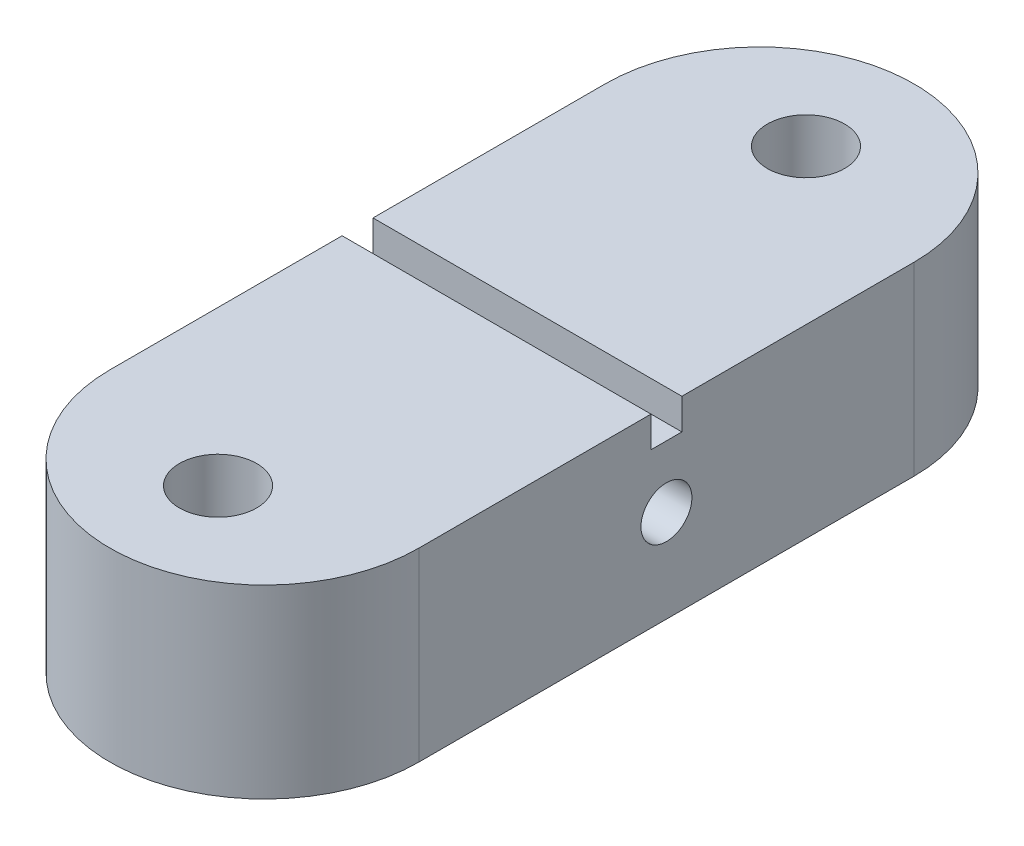
ISO-10303-21;
HEADER;
FILE_DESCRIPTION(('STEP AP214'),'2;1');
FILE_NAME('part.step','',(''),(''),'','','');
FILE_SCHEMA(('AUTOMOTIVE_DESIGN { 1 0 10303 214 1 1 1 1 }'));
ENDSEC;
DATA;
#1=APPLICATION_CONTEXT('core data for automotive mechanical design processes');
#2=APPLICATION_PROTOCOL_DEFINITION('international standard','automotive_design',2000,#1);
#3=PRODUCT_CONTEXT('',#1,'mechanical');
#4=PRODUCT('Part','Part','',(#3));
#5=PRODUCT_RELATED_PRODUCT_CATEGORY('part','',(#4));
#6=PRODUCT_DEFINITION_FORMATION('','',#4);
#7=PRODUCT_DEFINITION_CONTEXT('part definition',#1,'design');
#8=PRODUCT_DEFINITION('design','',#6,#7);
#9=PRODUCT_DEFINITION_SHAPE('','',#8);
#10=(LENGTH_UNIT() NAMED_UNIT(*) SI_UNIT(.MILLI.,.METRE.));
#11=(NAMED_UNIT(*) PLANE_ANGLE_UNIT() SI_UNIT($,.RADIAN.));
#12=(NAMED_UNIT(*) SI_UNIT($,.STERADIAN.) SOLID_ANGLE_UNIT());
#13=UNCERTAINTY_MEASURE_WITH_UNIT(LENGTH_MEASURE(1.E-05),#10,'distance_accuracy_value','');
#14=(GEOMETRIC_REPRESENTATION_CONTEXT(3) GLOBAL_UNCERTAINTY_ASSIGNED_CONTEXT((#13)) GLOBAL_UNIT_ASSIGNED_CONTEXT((#10,
#11,#12)) REPRESENTATION_CONTEXT('',''));
#15=CARTESIAN_POINT('',(0.,0.,0.));
#16=DIRECTION('',(0.,0.,1.));
#17=DIRECTION('',(1.,0.,0.));
#18=AXIS2_PLACEMENT_3D('',#15,#16,#17);
#19=CARTESIAN_POINT('',(0.,6.,16.035));
#20=DIRECTION('',(0.,1.,0.));
#21=DIRECTION('',(0.,0.,1.));
#22=AXIS2_PLACEMENT_3D('',#19,#20,#21);
#23=CYLINDRICAL_SURFACE('',#22,10.);
#24=DIRECTION('',(0.,1.,0.));
#25=VECTOR('',#24,1.);
#26=CARTESIAN_POINT('',(10.,6.,16.035));
#27=LINE('',#26,#25);
#28=CARTESIAN_POINT('',(10.,6.,16.035));
#29=VERTEX_POINT('',#28);
#30=CARTESIAN_POINT('',(10.,-6.,16.035));
#31=VERTEX_POINT('',#30);
#32=EDGE_CURVE('E158',#29,#31,#27,.F.);
#33=ORIENTED_EDGE('',*,*,#32,.F.);
#34=CARTESIAN_POINT('',(0.,6.,16.035));
#35=DIRECTION('',(0.,-1.,0.));
#36=DIRECTION('',(0.,0.,-1.));
#37=AXIS2_PLACEMENT_3D('',#34,#35,#36);
#38=CIRCLE('',#37,10.);
#39=CARTESIAN_POINT('',(-10.,6.,16.035));
#40=VERTEX_POINT('',#39);
#41=EDGE_CURVE('E57',#40,#29,#38,.F.);
#42=ORIENTED_EDGE('',*,*,#41,.F.);
#43=DIRECTION('',(0.,1.,0.));
#44=VECTOR('',#43,1.);
#45=CARTESIAN_POINT('',(-10.,6.,16.035));
#46=LINE('',#45,#44);
#47=CARTESIAN_POINT('',(-10.,-6.,16.035));
#48=VERTEX_POINT('',#47);
#49=EDGE_CURVE('E161',#48,#40,#46,.T.);
#50=ORIENTED_EDGE('',*,*,#49,.F.);
#51=CARTESIAN_POINT('',(0.,-6.,16.035));
#52=DIRECTION('',(0.,1.,0.));
#53=DIRECTION('',(0.,0.,1.));
#54=AXIS2_PLACEMENT_3D('',#51,#52,#53);
#55=CIRCLE('',#54,10.);
#56=EDGE_CURVE('E13',#31,#48,#55,.F.);
#57=ORIENTED_EDGE('',*,*,#56,.F.);
#58=EDGE_LOOP('',(#33,#42,#50,#57));
#59=FACE_BOUND('',#58,.T.);
#60=ADVANCED_FACE('F49',(#59),#23,.T.);
#61=CARTESIAN_POINT('',(0.,6.,-16.035));
#62=DIRECTION('',(0.,-1.,0.));
#63=DIRECTION('',(0.,0.,-1.));
#64=AXIS2_PLACEMENT_3D('',#61,#62,#63);
#65=CYLINDRICAL_SURFACE('',#64,10.);
#66=DIRECTION('',(0.,1.,0.));
#67=VECTOR('',#66,1.);
#68=CARTESIAN_POINT('',(-10.,6.,-16.035));
#69=LINE('',#68,#67);
#70=CARTESIAN_POINT('',(-10.,6.,-16.035));
#71=VERTEX_POINT('',#70);
#72=CARTESIAN_POINT('',(-10.,-6.,-16.035));
#73=VERTEX_POINT('',#72);
#74=EDGE_CURVE('E149',#71,#73,#69,.F.);
#75=ORIENTED_EDGE('',*,*,#74,.F.);
#76=CARTESIAN_POINT('',(0.,6.,-16.035));
#77=DIRECTION('',(0.,-1.,0.));
#78=DIRECTION('',(0.,0.,-1.));
#79=AXIS2_PLACEMENT_3D('',#76,#77,#78);
#80=CIRCLE('',#79,10.);
#81=CARTESIAN_POINT('',(10.,6.,-16.035));
#82=VERTEX_POINT('',#81);
#83=EDGE_CURVE('E153',#82,#71,#80,.F.);
#84=ORIENTED_EDGE('',*,*,#83,.F.);
#85=DIRECTION('',(0.,1.,0.));
#86=VECTOR('',#85,1.);
#87=CARTESIAN_POINT('',(10.,6.,-16.035));
#88=LINE('',#87,#86);
#89=CARTESIAN_POINT('',(10.,-6.,-16.035));
#90=VERTEX_POINT('',#89);
#91=EDGE_CURVE('E138',#90,#82,#88,.T.);
#92=ORIENTED_EDGE('',*,*,#91,.F.);
#93=CARTESIAN_POINT('',(0.,-6.,-16.035));
#94=DIRECTION('',(0.,1.,0.));
#95=DIRECTION('',(0.,0.,1.));
#96=AXIS2_PLACEMENT_3D('',#93,#94,#95);
#97=CIRCLE('',#96,10.);
#98=EDGE_CURVE('E155',#73,#90,#97,.F.);
#99=ORIENTED_EDGE('',*,*,#98,.F.);
#100=EDGE_LOOP('',(#75,#84,#92,#99));
#101=FACE_BOUND('',#100,.T.);
#102=ADVANCED_FACE('F220',(#101),#65,.T.);
#103=CARTESIAN_POINT('',(10.,6.,26.035));
#104=DIRECTION('',(0.,-1.,0.));
#105=DIRECTION('',(0.,0.,-1.));
#106=AXIS2_PLACEMENT_3D('',#103,#104,#105);
#107=PLANE('',#106);
#108=CARTESIAN_POINT('',(0.,6.,-19.035));
#109=DIRECTION('',(0.,1.,0.));
#110=DIRECTION('',(0.,0.,1.));
#111=AXIS2_PLACEMENT_3D('',#108,#109,#110);
#112=CIRCLE('',#111,2.49999999999999);
#113=CARTESIAN_POINT('',(0.,6.,-16.535));
#114=VERTEX_POINT('',#113);
#115=EDGE_CURVE('E193',#114,#114,#112,.T.);
#116=ORIENTED_EDGE('',*,*,#115,.F.);
#117=EDGE_LOOP('',(#116));
#118=FACE_BOUND('',#117,.T.);
#119=DIRECTION('',(0.,0.,-1.));
#120=VECTOR('',#119,1.);
#121=CARTESIAN_POINT('',(10.,6.,26.035));
#122=LINE('',#121,#120);
#123=CARTESIAN_POINT('',(10.,6.,-1.));
#124=VERTEX_POINT('',#123);
#125=EDGE_CURVE('E128',#124,#82,#122,.T.);
#126=ORIENTED_EDGE('',*,*,#125,.T.);
#127=ORIENTED_EDGE('',*,*,#83,.T.);
#128=DIRECTION('',(0.,0.,-1.));
#129=VECTOR('',#128,1.);
#130=CARTESIAN_POINT('',(-10.,6.,26.035));
#131=LINE('',#130,#129);
#132=CARTESIAN_POINT('',(-10.,6.,-1.));
#133=VERTEX_POINT('',#132);
#134=EDGE_CURVE('E130',#133,#71,#131,.T.);
#135=ORIENTED_EDGE('',*,*,#134,.F.);
#136=DIRECTION('',(1.,0.,0.));
#137=VECTOR('',#136,1.);
#138=CARTESIAN_POINT('',(-10.,6.,-1.));
#139=LINE('',#138,#137);
#140=EDGE_CURVE('E114',#133,#124,#139,.T.);
#141=ORIENTED_EDGE('',*,*,#140,.T.);
#142=EDGE_LOOP('',(#126,#127,#135,#141));
#143=FACE_BOUND('',#142,.T.);
#144=ADVANCED_FACE('F127',(#118,#143),#107,.F.);
#145=CARTESIAN_POINT('',(-10.,6.,0.999999999999999));
#146=VERTEX_POINT('',#145);
#147=EDGE_CURVE('E140',#40,#146,#131,.T.);
#148=ORIENTED_EDGE('',*,*,#147,.F.);
#149=ORIENTED_EDGE('',*,*,#41,.T.);
#150=CARTESIAN_POINT('',(10.,6.,1.));
#151=VERTEX_POINT('',#150);
#152=EDGE_CURVE('E139',#29,#151,#122,.T.);
#153=ORIENTED_EDGE('',*,*,#152,.T.);
#154=DIRECTION('',(1.,0.,0.));
#155=VECTOR('',#154,1.);
#156=CARTESIAN_POINT('',(-10.,6.,0.999999999999999));
#157=LINE('',#156,#155);
#158=EDGE_CURVE('E131',#146,#151,#157,.T.);
#159=ORIENTED_EDGE('',*,*,#158,.F.);
#160=EDGE_LOOP('',(#148,#149,#153,#159));
#161=FACE_BOUND('',#160,.T.);
#162=CARTESIAN_POINT('',(0.,6.,19.035));
#163=DIRECTION('',(0.,1.,0.));
#164=DIRECTION('',(0.,0.,1.));
#165=AXIS2_PLACEMENT_3D('',#162,#163,#164);
#166=CIRCLE('',#165,2.49999999999999);
#167=CARTESIAN_POINT('',(0.,6.,21.535));
#168=VERTEX_POINT('',#167);
#169=EDGE_CURVE('E184',#168,#168,#166,.T.);
#170=ORIENTED_EDGE('',*,*,#169,.F.);
#171=EDGE_LOOP('',(#170));
#172=FACE_BOUND('',#171,.T.);
#173=ADVANCED_FACE('F164',(#161,#172),#107,.F.);
#174=CARTESIAN_POINT('',(-10.,6.,26.035));
#175=DIRECTION('',(1.,0.,0.));
#176=DIRECTION('',(0.,0.,-1.));
#177=AXIS2_PLACEMENT_3D('',#174,#175,#176);
#178=PLANE('',#177);
#179=CARTESIAN_POINT('',(-10.,0.,0.));
#180=DIRECTION('',(-1.,0.,0.));
#181=DIRECTION('',(0.,0.,1.));
#182=AXIS2_PLACEMENT_3D('',#179,#180,#181);
#183=CIRCLE('',#182,1.65);
#184=CARTESIAN_POINT('',(-10.,0.,1.65));
#185=VERTEX_POINT('',#184);
#186=EDGE_CURVE('E339',#185,#185,#183,.T.);
#187=ORIENTED_EDGE('',*,*,#186,.F.);
#188=EDGE_LOOP('',(#187));
#189=FACE_BOUND('',#188,.T.);
#190=DIRECTION('',(0.,0.,-1.));
#191=VECTOR('',#190,1.);
#192=CARTESIAN_POINT('',(-10.,-6.,26.035));
#193=LINE('',#192,#191);
#194=EDGE_CURVE('E147',#48,#73,#193,.T.);
#195=ORIENTED_EDGE('',*,*,#194,.F.);
#196=ORIENTED_EDGE('',*,*,#49,.T.);
#197=ORIENTED_EDGE('',*,*,#147,.T.);
#198=DIRECTION('',(0.,-1.,0.));
#199=VECTOR('',#198,1.);
#200=CARTESIAN_POINT('',(-10.,4.,1.));
#201=LINE('',#200,#199);
#202=CARTESIAN_POINT('',(-10.,4.,1.));
#203=VERTEX_POINT('',#202);
#204=EDGE_CURVE('E178',#146,#203,#201,.T.);
#205=ORIENTED_EDGE('',*,*,#204,.T.);
#206=DIRECTION('',(0.,0.,-1.));
#207=VECTOR('',#206,1.);
#208=CARTESIAN_POINT('',(-10.,4.,1.));
#209=LINE('',#208,#207);
#210=CARTESIAN_POINT('',(-10.,4.,-1.));
#211=VERTEX_POINT('',#210);
#212=EDGE_CURVE('E132',#203,#211,#209,.T.);
#213=ORIENTED_EDGE('',*,*,#212,.T.);
#214=DIRECTION('',(0.,1.,0.));
#215=VECTOR('',#214,1.);
#216=CARTESIAN_POINT('',(-10.,4.,-1.));
#217=LINE('',#216,#215);
#218=EDGE_CURVE('E173',#211,#133,#217,.T.);
#219=ORIENTED_EDGE('',*,*,#218,.T.);
#220=ORIENTED_EDGE('',*,*,#134,.T.);
#221=ORIENTED_EDGE('',*,*,#74,.T.);
#222=EDGE_LOOP('',(#195,#196,#197,#205,#213,#219,#220,#221));
#223=FACE_BOUND('',#222,.T.);
#224=ADVANCED_FACE('F201',(#189,#223),#178,.F.);
#225=CARTESIAN_POINT('',(10.,-6.,26.035));
#226=DIRECTION('',(0.,1.,0.));
#227=DIRECTION('',(0.,0.,1.));
#228=AXIS2_PLACEMENT_3D('',#225,#226,#227);
#229=PLANE('',#228);
#230=CARTESIAN_POINT('',(0.,-6.,19.035));
#231=DIRECTION('',(0.,1.,0.));
#232=DIRECTION('',(0.,0.,1.));
#233=AXIS2_PLACEMENT_3D('',#230,#231,#232);
#234=CIRCLE('',#233,2.5);
#235=CARTESIAN_POINT('',(0.,-6.,21.535));
#236=VERTEX_POINT('',#235);
#237=EDGE_CURVE('E190',#236,#236,#234,.T.);
#238=ORIENTED_EDGE('',*,*,#237,.T.);
#239=EDGE_LOOP('',(#238));
#240=FACE_BOUND('',#239,.T.);
#241=CARTESIAN_POINT('',(0.,-6.,-19.035));
#242=DIRECTION('',(0.,1.,0.));
#243=DIRECTION('',(0.,0.,1.));
#244=AXIS2_PLACEMENT_3D('',#241,#242,#243);
#245=CIRCLE('',#244,2.5);
#246=CARTESIAN_POINT('',(0.,-6.,-16.535));
#247=VERTEX_POINT('',#246);
#248=EDGE_CURVE('E195',#247,#247,#245,.T.);
#249=ORIENTED_EDGE('',*,*,#248,.T.);
#250=EDGE_LOOP('',(#249));
#251=FACE_BOUND('',#250,.T.);
#252=DIRECTION('',(0.,0.,-1.));
#253=VECTOR('',#252,1.);
#254=CARTESIAN_POINT('',(10.,-6.,26.035));
#255=LINE('',#254,#253);
#256=EDGE_CURVE('E142',#31,#90,#255,.T.);
#257=ORIENTED_EDGE('',*,*,#256,.F.);
#258=ORIENTED_EDGE('',*,*,#56,.T.);
#259=ORIENTED_EDGE('',*,*,#194,.T.);
#260=ORIENTED_EDGE('',*,*,#98,.T.);
#261=EDGE_LOOP('',(#257,#258,#259,#260));
#262=FACE_BOUND('',#261,.T.);
#263=ADVANCED_FACE('F236',(#240,#251,#262),#229,.F.);
#264=CARTESIAN_POINT('',(10.,6.,26.035));
#265=DIRECTION('',(-1.,0.,0.));
#266=DIRECTION('',(0.,0.,1.));
#267=AXIS2_PLACEMENT_3D('',#264,#265,#266);
#268=PLANE('',#267);
#269=CARTESIAN_POINT('',(10.,0.,0.));
#270=DIRECTION('',(-1.,0.,0.));
#271=DIRECTION('',(0.,0.,1.));
#272=AXIS2_PLACEMENT_3D('',#269,#270,#271);
#273=CIRCLE('',#272,1.65);
#274=CARTESIAN_POINT('',(10.,0.,1.65));
#275=VERTEX_POINT('',#274);
#276=EDGE_CURVE('E122',#275,#275,#273,.T.);
#277=ORIENTED_EDGE('',*,*,#276,.T.);
#278=EDGE_LOOP('',(#277));
#279=FACE_BOUND('',#278,.T.);
#280=ORIENTED_EDGE('',*,*,#152,.F.);
#281=ORIENTED_EDGE('',*,*,#32,.T.);
#282=ORIENTED_EDGE('',*,*,#256,.T.);
#283=ORIENTED_EDGE('',*,*,#91,.T.);
#284=ORIENTED_EDGE('',*,*,#125,.F.);
#285=DIRECTION('',(0.,1.,0.));
#286=VECTOR('',#285,1.);
#287=CARTESIAN_POINT('',(10.,4.,-1.));
#288=LINE('',#287,#286);
#289=CARTESIAN_POINT('',(10.,4.,-1.));
#290=VERTEX_POINT('',#289);
#291=EDGE_CURVE('E110',#290,#124,#288,.T.);
#292=ORIENTED_EDGE('',*,*,#291,.F.);
#293=DIRECTION('',(0.,0.,-1.));
#294=VECTOR('',#293,1.);
#295=CARTESIAN_POINT('',(10.,4.,1.));
#296=LINE('',#295,#294);
#297=CARTESIAN_POINT('',(10.,4.,1.));
#298=VERTEX_POINT('',#297);
#299=EDGE_CURVE('E170',#298,#290,#296,.T.);
#300=ORIENTED_EDGE('',*,*,#299,.F.);
#301=DIRECTION('',(0.,-1.,0.));
#302=VECTOR('',#301,1.);
#303=CARTESIAN_POINT('',(10.,4.,1.));
#304=LINE('',#303,#302);
#305=EDGE_CURVE('E121',#151,#298,#304,.T.);
#306=ORIENTED_EDGE('',*,*,#305,.F.);
#307=EDGE_LOOP('',(#280,#281,#282,#283,#284,#292,#300,#306));
#308=FACE_BOUND('',#307,.T.);
#309=ADVANCED_FACE('F136',(#279,#308),#268,.F.);
#310=CARTESIAN_POINT('',(0.,6.,-19.035));
#311=DIRECTION('',(0.,1.,0.));
#312=DIRECTION('',(0.,0.,1.));
#313=AXIS2_PLACEMENT_3D('',#310,#311,#312);
#314=CYLINDRICAL_SURFACE('',#313,2.49999999999999);
#315=ORIENTED_EDGE('',*,*,#248,.F.);
#316=EDGE_LOOP('',(#315));
#317=FACE_BOUND('',#316,.T.);
#318=ORIENTED_EDGE('',*,*,#115,.T.);
#319=EDGE_LOOP('',(#318));
#320=FACE_BOUND('',#319,.T.);
#321=ADVANCED_FACE('F242',(#317,#320),#314,.F.);
#322=CARTESIAN_POINT('',(0.,6.,19.035));
#323=DIRECTION('',(0.,1.,0.));
#324=DIRECTION('',(0.,0.,1.));
#325=AXIS2_PLACEMENT_3D('',#322,#323,#324);
#326=CYLINDRICAL_SURFACE('',#325,2.49999999999999);
#327=ORIENTED_EDGE('',*,*,#237,.F.);
#328=EDGE_LOOP('',(#327));
#329=FACE_BOUND('',#328,.T.);
#330=ORIENTED_EDGE('',*,*,#169,.T.);
#331=EDGE_LOOP('',(#330));
#332=FACE_BOUND('',#331,.T.);
#333=ADVANCED_FACE('F248',(#329,#332),#326,.F.);
#334=CARTESIAN_POINT('',(-10.,4.,-1.));
#335=DIRECTION('',(0.,0.,-1.));
#336=DIRECTION('',(0.,1.,0.));
#337=AXIS2_PLACEMENT_3D('',#334,#335,#336);
#338=PLANE('',#337);
#339=ORIENTED_EDGE('',*,*,#140,.F.);
#340=ORIENTED_EDGE('',*,*,#218,.F.);
#341=DIRECTION('',(1.,0.,0.));
#342=VECTOR('',#341,1.);
#343=CARTESIAN_POINT('',(-10.,4.,-1.));
#344=LINE('',#343,#342);
#345=EDGE_CURVE('E116',#211,#290,#344,.T.);
#346=ORIENTED_EDGE('',*,*,#345,.T.);
#347=ORIENTED_EDGE('',*,*,#291,.T.);
#348=EDGE_LOOP('',(#339,#340,#346,#347));
#349=FACE_BOUND('',#348,.T.);
#350=ADVANCED_FACE('F112',(#349),#338,.F.);
#351=CARTESIAN_POINT('',(-10.,4.,1.));
#352=DIRECTION('',(0.,-1.,0.));
#353=DIRECTION('',(0.,0.,-1.));
#354=AXIS2_PLACEMENT_3D('',#351,#352,#353);
#355=PLANE('',#354);
#356=ORIENTED_EDGE('',*,*,#345,.F.);
#357=ORIENTED_EDGE('',*,*,#212,.F.);
#358=DIRECTION('',(1.,0.,0.));
#359=VECTOR('',#358,1.);
#360=CARTESIAN_POINT('',(-10.,4.,1.));
#361=LINE('',#360,#359);
#362=EDGE_CURVE('E185',#203,#298,#361,.T.);
#363=ORIENTED_EDGE('',*,*,#362,.T.);
#364=ORIENTED_EDGE('',*,*,#299,.T.);
#365=EDGE_LOOP('',(#356,#357,#363,#364));
#366=FACE_BOUND('',#365,.T.);
#367=ADVANCED_FACE('F206',(#366),#355,.F.);
#368=CARTESIAN_POINT('',(-10.,4.,1.));
#369=DIRECTION('',(0.,0.,1.));
#370=DIRECTION('',(0.,-1.,0.));
#371=AXIS2_PLACEMENT_3D('',#368,#369,#370);
#372=PLANE('',#371);
#373=ORIENTED_EDGE('',*,*,#362,.F.);
#374=ORIENTED_EDGE('',*,*,#204,.F.);
#375=ORIENTED_EDGE('',*,*,#158,.T.);
#376=ORIENTED_EDGE('',*,*,#305,.T.);
#377=EDGE_LOOP('',(#373,#374,#375,#376));
#378=FACE_BOUND('',#377,.T.);
#379=ADVANCED_FACE('F207',(#378),#372,.F.);
#380=CARTESIAN_POINT('',(-10.,0.,0.));
#381=DIRECTION('',(-1.,0.,0.));
#382=DIRECTION('',(0.,0.,1.));
#383=AXIS2_PLACEMENT_3D('',#380,#381,#382);
#384=CYLINDRICAL_SURFACE('',#383,1.65);
#385=ORIENTED_EDGE('',*,*,#276,.F.);
#386=EDGE_LOOP('',(#385));
#387=FACE_BOUND('',#386,.T.);
#388=ORIENTED_EDGE('',*,*,#186,.T.);
#389=EDGE_LOOP('',(#388));
#390=FACE_BOUND('',#389,.T.);
#391=ADVANCED_FACE('F209',(#387,#390),#384,.F.);
#392=CLOSED_SHELL('',(#60,#102,#144,#173,#224,#263,#309,#321,#333,#350,#367,#379,#391));
#393=MANIFOLD_SOLID_BREP('B2',#392);
#394=ADVANCED_BREP_SHAPE_REPRESENTATION('',(#18,#393),#14);
#395=SHAPE_DEFINITION_REPRESENTATION(#9,#394);
ENDSEC;
END-ISO-10303-21;
